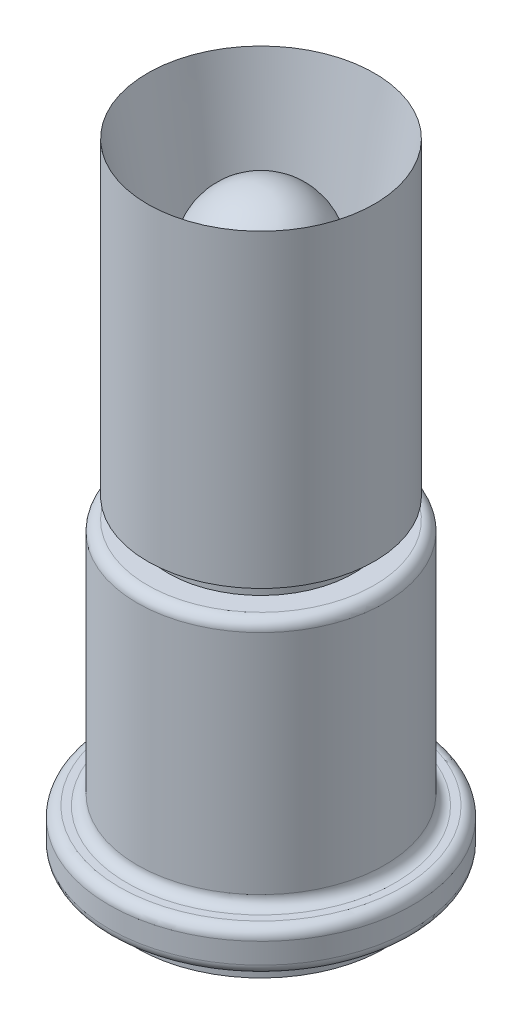
ISO-10303-21;
HEADER;
FILE_DESCRIPTION(('STEP AP214'),'2;1');
FILE_NAME('part.step','',(''),(''),'','','');
FILE_SCHEMA(('AUTOMOTIVE_DESIGN { 1 0 10303 214 1 1 1 1 }'));
ENDSEC;
DATA;
#1=APPLICATION_CONTEXT('core data for automotive mechanical design processes');
#2=APPLICATION_PROTOCOL_DEFINITION('international standard','automotive_design',2000,#1);
#3=PRODUCT_CONTEXT('',#1,'mechanical');
#4=PRODUCT('Part','Part','',(#3));
#5=PRODUCT_RELATED_PRODUCT_CATEGORY('part','',(#4));
#6=PRODUCT_DEFINITION_FORMATION('','',#4);
#7=PRODUCT_DEFINITION_CONTEXT('part definition',#1,'design');
#8=PRODUCT_DEFINITION('design','',#6,#7);
#9=PRODUCT_DEFINITION_SHAPE('','',#8);
#10=(LENGTH_UNIT() NAMED_UNIT(*) SI_UNIT(.MILLI.,.METRE.));
#11=(NAMED_UNIT(*) PLANE_ANGLE_UNIT() SI_UNIT($,.RADIAN.));
#12=(NAMED_UNIT(*) SI_UNIT($,.STERADIAN.) SOLID_ANGLE_UNIT());
#13=UNCERTAINTY_MEASURE_WITH_UNIT(LENGTH_MEASURE(1.E-05),#10,'distance_accuracy_value','');
#14=(GEOMETRIC_REPRESENTATION_CONTEXT(3) GLOBAL_UNCERTAINTY_ASSIGNED_CONTEXT((#13)) GLOBAL_UNIT_ASSIGNED_CONTEXT((#10,
#11,#12)) REPRESENTATION_CONTEXT('',''));
#15=CARTESIAN_POINT('',(0.,0.,0.));
#16=DIRECTION('',(0.,0.,1.));
#17=DIRECTION('',(1.,0.,0.));
#18=AXIS2_PLACEMENT_3D('',#15,#16,#17);
#19=CARTESIAN_POINT('',(0.,0.,0.));
#20=DIRECTION('',(0.,1.,0.));
#21=DIRECTION('',(0.,0.,1.));
#22=AXIS2_PLACEMENT_3D('',#19,#20,#21);
#23=PLANE('',#22);
#24=CARTESIAN_POINT('',(0.,0.,0.));
#25=DIRECTION('',(0.,1.,0.));
#26=DIRECTION('',(0.,0.,1.));
#27=AXIS2_PLACEMENT_3D('',#24,#25,#26);
#28=CIRCLE('',#27,3.43);
#29=CARTESIAN_POINT('',(0.,0.,3.43));
#30=VERTEX_POINT('',#29);
#31=EDGE_CURVE('E57',#30,#30,#28,.F.);
#32=ORIENTED_EDGE('',*,*,#31,.T.);
#33=EDGE_LOOP('',(#32));
#34=FACE_BOUND('',#33,.T.);
#35=CARTESIAN_POINT('',(0.,0.,0.));
#36=DIRECTION('',(0.,1.,0.));
#37=DIRECTION('',(0.,0.,1.));
#38=AXIS2_PLACEMENT_3D('',#35,#36,#37);
#39=CIRCLE('',#38,3.);
#40=CARTESIAN_POINT('',(0.,0.,3.));
#41=VERTEX_POINT('',#40);
#42=EDGE_CURVE('E70',#41,#41,#39,.T.);
#43=ORIENTED_EDGE('',*,*,#42,.T.);
#44=EDGE_LOOP('',(#43));
#45=FACE_BOUND('',#44,.T.);
#46=ADVANCED_FACE('F34',(#34,#45),#23,.F.);
#47=CARTESIAN_POINT('',(0.,15.,0.));
#48=DIRECTION('',(0.,1.,0.));
#49=DIRECTION('',(0.,0.,1.));
#50=AXIS2_PLACEMENT_3D('',#47,#48,#49);
#51=CYLINDRICAL_SURFACE('',#50,3.68);
#52=CARTESIAN_POINT('',(0.,0.25,0.));
#53=DIRECTION('',(0.,1.,0.));
#54=DIRECTION('',(0.,0.,1.));
#55=AXIS2_PLACEMENT_3D('',#52,#53,#54);
#56=CIRCLE('',#55,3.68);
#57=CARTESIAN_POINT('',(0.,0.25,3.68));
#58=VERTEX_POINT('',#57);
#59=EDGE_CURVE('E60',#58,#58,#56,.T.);
#60=ORIENTED_EDGE('',*,*,#59,.T.);
#61=EDGE_LOOP('',(#60));
#62=FACE_BOUND('',#61,.T.);
#63=CARTESIAN_POINT('',(0.,0.750000000000001,0.));
#64=DIRECTION('',(0.,-1.,0.));
#65=DIRECTION('',(0.,0.,-1.));
#66=AXIS2_PLACEMENT_3D('',#63,#64,#65);
#67=CIRCLE('',#66,3.68);
#68=CARTESIAN_POINT('',(0.,0.750000000000001,-3.68));
#69=VERTEX_POINT('',#68);
#70=EDGE_CURVE('E63',#69,#69,#67,.T.);
#71=ORIENTED_EDGE('',*,*,#70,.T.);
#72=EDGE_LOOP('',(#71));
#73=FACE_BOUND('',#72,.T.);
#74=ADVANCED_FACE('F109',(#62,#73),#51,.T.);
#75=CARTESIAN_POINT('',(0.,1.,-3.68));
#76=DIRECTION('',(0.,-1.,0.));
#77=DIRECTION('',(0.,0.,-1.));
#78=AXIS2_PLACEMENT_3D('',#75,#76,#77);
#79=PLANE('',#78);
#80=CARTESIAN_POINT('',(0.,1.,0.));
#81=DIRECTION('',(0.,-1.,0.));
#82=DIRECTION('',(0.,0.,-1.));
#83=AXIS2_PLACEMENT_3D('',#80,#81,#82);
#84=CIRCLE('',#83,3.43);
#85=CARTESIAN_POINT('',(0.,1.,-3.43));
#86=VERTEX_POINT('',#85);
#87=EDGE_CURVE('E49',#86,#86,#84,.F.);
#88=ORIENTED_EDGE('',*,*,#87,.T.);
#89=EDGE_LOOP('',(#88));
#90=FACE_BOUND('',#89,.T.);
#91=CARTESIAN_POINT('',(0.,1.,0.));
#92=DIRECTION('',(0.,-1.,0.));
#93=DIRECTION('',(0.,0.,-1.));
#94=AXIS2_PLACEMENT_3D('',#91,#92,#93);
#95=CIRCLE('',#94,3.25);
#96=CARTESIAN_POINT('',(0.,1.,-3.25));
#97=VERTEX_POINT('',#96);
#98=EDGE_CURVE('E54',#97,#97,#95,.T.);
#99=ORIENTED_EDGE('',*,*,#98,.T.);
#100=EDGE_LOOP('',(#99));
#101=FACE_BOUND('',#100,.T.);
#102=ADVANCED_FACE('F115',(#90,#101),#79,.F.);
#103=CARTESIAN_POINT('',(0.,15.,0.));
#104=DIRECTION('',(0.,1.,0.));
#105=DIRECTION('',(0.,0.,1.));
#106=AXIS2_PLACEMENT_3D('',#103,#104,#105);
#107=CYLINDRICAL_SURFACE('',#106,3.);
#108=CARTESIAN_POINT('',(0.,6.75,0.));
#109=DIRECTION('',(0.,-1.,0.));
#110=DIRECTION('',(0.,0.,-1.));
#111=AXIS2_PLACEMENT_3D('',#108,#109,#110);
#112=CIRCLE('',#111,3.);
#113=CARTESIAN_POINT('',(0.,6.75,-3.));
#114=VERTEX_POINT('',#113);
#115=EDGE_CURVE('E10',#114,#114,#112,.T.);
#116=ORIENTED_EDGE('',*,*,#115,.T.);
#117=EDGE_LOOP('',(#116));
#118=FACE_BOUND('',#117,.T.);
#119=CARTESIAN_POINT('',(0.,1.25,0.));
#120=DIRECTION('',(0.,-1.,0.));
#121=DIRECTION('',(0.,0.,-1.));
#122=AXIS2_PLACEMENT_3D('',#119,#120,#121);
#123=CIRCLE('',#122,3.);
#124=CARTESIAN_POINT('',(0.,1.25,-3.));
#125=VERTEX_POINT('',#124);
#126=EDGE_CURVE('E41',#125,#125,#123,.F.);
#127=ORIENTED_EDGE('',*,*,#126,.T.);
#128=EDGE_LOOP('',(#127));
#129=FACE_BOUND('',#128,.T.);
#130=ADVANCED_FACE('F143',(#118,#129),#107,.T.);
#131=CARTESIAN_POINT('',(0.,7.,-3.));
#132=DIRECTION('',(0.,-1.,0.));
#133=DIRECTION('',(0.,0.,-1.));
#134=AXIS2_PLACEMENT_3D('',#131,#132,#133);
#135=PLANE('',#134);
#136=CARTESIAN_POINT('',(0.,7.,0.));
#137=DIRECTION('',(0.,-1.,0.));
#138=DIRECTION('',(0.,0.,-1.));
#139=AXIS2_PLACEMENT_3D('',#136,#137,#138);
#140=CIRCLE('',#139,2.75);
#141=CARTESIAN_POINT('',(0.,7.,-2.75));
#142=VERTEX_POINT('',#141);
#143=EDGE_CURVE('E45',#142,#142,#140,.F.);
#144=ORIENTED_EDGE('',*,*,#143,.T.);
#145=EDGE_LOOP('',(#144));
#146=FACE_BOUND('',#145,.T.);
#147=CARTESIAN_POINT('',(0.,7.,0.));
#148=DIRECTION('',(0.,1.,0.));
#149=DIRECTION('',(0.,0.,1.));
#150=AXIS2_PLACEMENT_3D('',#147,#148,#149);
#151=CIRCLE('',#150,2.25);
#152=CARTESIAN_POINT('',(0.,7.,2.25));
#153=VERTEX_POINT('',#152);
#154=EDGE_CURVE('E66',#153,#153,#151,.T.);
#155=ORIENTED_EDGE('',*,*,#154,.F.);
#156=EDGE_LOOP('',(#155));
#157=FACE_BOUND('',#156,.T.);
#158=ADVANCED_FACE('F139',(#146,#157),#135,.F.);
#159=CARTESIAN_POINT('',(0.,15.,0.));
#160=DIRECTION('',(0.,1.,0.));
#161=DIRECTION('',(0.,0.,1.));
#162=AXIS2_PLACEMENT_3D('',#159,#160,#161);
#163=CYLINDRICAL_SURFACE('',#162,2.25);
#164=CARTESIAN_POINT('',(0.,7.5,0.));
#165=DIRECTION('',(0.,1.,0.));
#166=DIRECTION('',(0.,0.,1.));
#167=AXIS2_PLACEMENT_3D('',#164,#165,#166);
#168=CIRCLE('',#167,2.25);
#169=CARTESIAN_POINT('',(0.,7.5,2.25));
#170=VERTEX_POINT('',#169);
#171=EDGE_CURVE('E74',#170,#170,#168,.T.);
#172=ORIENTED_EDGE('',*,*,#171,.F.);
#173=EDGE_LOOP('',(#172));
#174=FACE_BOUND('',#173,.T.);
#175=ORIENTED_EDGE('',*,*,#154,.T.);
#176=EDGE_LOOP('',(#175));
#177=FACE_BOUND('',#176,.T.);
#178=ADVANCED_FACE('F142',(#174,#177),#163,.T.);
#179=CARTESIAN_POINT('',(0.,7.5,-2.25));
#180=DIRECTION('',(0.,1.,0.));
#181=DIRECTION('',(0.,0.,1.));
#182=AXIS2_PLACEMENT_3D('',#179,#180,#181);
#183=PLANE('',#182);
#184=CARTESIAN_POINT('',(0.,7.5,0.));
#185=DIRECTION('',(0.,1.,0.));
#186=DIRECTION('',(0.,0.,1.));
#187=AXIS2_PLACEMENT_3D('',#184,#185,#186);
#188=CIRCLE('',#187,2.75);
#189=CARTESIAN_POINT('',(0.,7.5,2.75));
#190=VERTEX_POINT('',#189);
#191=EDGE_CURVE('E77',#190,#190,#188,.T.);
#192=ORIENTED_EDGE('',*,*,#191,.F.);
#193=EDGE_LOOP('',(#192));
#194=FACE_BOUND('',#193,.T.);
#195=ORIENTED_EDGE('',*,*,#171,.T.);
#196=EDGE_LOOP('',(#195));
#197=FACE_BOUND('',#196,.T.);
#198=ADVANCED_FACE('F148',(#194,#197),#183,.F.);
#199=CARTESIAN_POINT('',(0.,15.,0.));
#200=DIRECTION('',(0.,1.,0.));
#201=DIRECTION('',(0.,0.,1.));
#202=AXIS2_PLACEMENT_3D('',#199,#200,#201);
#203=CYLINDRICAL_SURFACE('',#202,2.75);
#204=CARTESIAN_POINT('',(0.,15.,0.));
#205=DIRECTION('',(0.,1.,0.));
#206=DIRECTION('',(0.,0.,1.));
#207=AXIS2_PLACEMENT_3D('',#204,#205,#206);
#208=CIRCLE('',#207,2.75);
#209=CARTESIAN_POINT('',(0.,15.,2.75));
#210=VERTEX_POINT('',#209);
#211=EDGE_CURVE('E87',#210,#210,#208,.T.);
#212=ORIENTED_EDGE('',*,*,#211,.F.);
#213=EDGE_LOOP('',(#212));
#214=FACE_BOUND('',#213,.T.);
#215=ORIENTED_EDGE('',*,*,#191,.T.);
#216=EDGE_LOOP('',(#215));
#217=FACE_BOUND('',#216,.T.);
#218=ADVANCED_FACE('F154',(#214,#217),#203,.T.);
#219=CARTESIAN_POINT('',(0.,-0.5,0.));
#220=DIRECTION('',(0.,1.,0.));
#221=DIRECTION('',(0.,0.,1.));
#222=AXIS2_PLACEMENT_3D('',#219,#220,#221);
#223=PLANE('',#222);
#224=CARTESIAN_POINT('',(0.,-0.5,0.));
#225=DIRECTION('',(0.,1.,0.));
#226=DIRECTION('',(0.,0.,1.));
#227=AXIS2_PLACEMENT_3D('',#224,#225,#226);
#228=CIRCLE('',#227,0.86602540378444);
#229=CARTESIAN_POINT('',(0.,-0.5,0.866025403784439));
#230=VERTEX_POINT('',#229);
#231=EDGE_CURVE('E67',#230,#230,#228,.T.);
#232=ORIENTED_EDGE('',*,*,#231,.T.);
#233=EDGE_LOOP('',(#232));
#234=FACE_BOUND('',#233,.T.);
#235=CARTESIAN_POINT('',(0.,-0.5,0.));
#236=DIRECTION('',(0.,1.,0.));
#237=DIRECTION('',(0.,0.,1.));
#238=AXIS2_PLACEMENT_3D('',#235,#236,#237);
#239=CIRCLE('',#238,3.);
#240=CARTESIAN_POINT('',(0.,-0.500000000000001,3.));
#241=VERTEX_POINT('',#240);
#242=EDGE_CURVE('E80',#241,#241,#239,.T.);
#243=ORIENTED_EDGE('',*,*,#242,.F.);
#244=EDGE_LOOP('',(#243));
#245=FACE_BOUND('',#244,.T.);
#246=ADVANCED_FACE('F236',(#234,#245),#223,.F.);
#247=CARTESIAN_POINT('',(0.,0.,0.));
#248=DIRECTION('',(0.,1.,0.));
#249=DIRECTION('',(0.,0.,1.));
#250=AXIS2_PLACEMENT_3D('',#247,#248,#249);
#251=CYLINDRICAL_SURFACE('',#250,3.);
#252=ORIENTED_EDGE('',*,*,#42,.F.);
#253=EDGE_LOOP('',(#252));
#254=FACE_BOUND('',#253,.T.);
#255=ORIENTED_EDGE('',*,*,#242,.T.);
#256=EDGE_LOOP('',(#255));
#257=FACE_BOUND('',#256,.T.);
#258=ADVANCED_FACE('F228',(#254,#257),#251,.T.);
#259=CARTESIAN_POINT('',(0.,0.,0.));
#260=DIRECTION('',(0.,-1.,0.));
#261=DIRECTION('',(0.,0.,1.));
#262=AXIS2_PLACEMENT_3D('',#259,#260,#261);
#263=SPHERICAL_SURFACE('',#262,1.);
#264=ORIENTED_EDGE('',*,*,#231,.F.);
#265=EDGE_LOOP('',(#264));
#266=FACE_BOUND('',#265,.T.);
#267=ADVANCED_FACE('F125',(#266),#263,.T.);
#268=CARTESIAN_POINT('',(0.,0.25,0.));
#269=DIRECTION('',(0.,1.,0.));
#270=DIRECTION('',(0.,0.,1.));
#271=AXIS2_PLACEMENT_3D('',#268,#269,#270);
#272=TOROIDAL_SURFACE('',#271,3.43,0.25);
#273=ORIENTED_EDGE('',*,*,#31,.F.);
#274=EDGE_LOOP('',(#273));
#275=FACE_BOUND('',#274,.T.);
#276=ORIENTED_EDGE('',*,*,#59,.F.);
#277=EDGE_LOOP('',(#276));
#278=FACE_BOUND('',#277,.T.);
#279=ADVANCED_FACE('F121',(#275,#278),#272,.T.);
#280=CARTESIAN_POINT('',(0.,0.750000000000001,0.));
#281=DIRECTION('',(0.,-1.,0.));
#282=DIRECTION('',(0.,0.,-1.));
#283=AXIS2_PLACEMENT_3D('',#280,#281,#282);
#284=TOROIDAL_SURFACE('',#283,3.43,0.25);
#285=ORIENTED_EDGE('',*,*,#70,.F.);
#286=EDGE_LOOP('',(#285));
#287=FACE_BOUND('',#286,.T.);
#288=ORIENTED_EDGE('',*,*,#87,.F.);
#289=EDGE_LOOP('',(#288));
#290=FACE_BOUND('',#289,.T.);
#291=ADVANCED_FACE('F124',(#287,#290),#284,.T.);
#292=CARTESIAN_POINT('',(0.,6.75,0.));
#293=DIRECTION('',(0.,-1.,0.));
#294=DIRECTION('',(0.,0.,-1.));
#295=AXIS2_PLACEMENT_3D('',#292,#293,#294);
#296=TOROIDAL_SURFACE('',#295,2.75,0.25);
#297=ORIENTED_EDGE('',*,*,#115,.F.);
#298=EDGE_LOOP('',(#297));
#299=FACE_BOUND('',#298,.T.);
#300=ORIENTED_EDGE('',*,*,#143,.F.);
#301=EDGE_LOOP('',(#300));
#302=FACE_BOUND('',#301,.T.);
#303=ADVANCED_FACE('F128',(#299,#302),#296,.T.);
#304=CARTESIAN_POINT('',(0.,1.25,0.));
#305=DIRECTION('',(0.,-1.,0.));
#306=DIRECTION('',(0.,0.,-1.));
#307=AXIS2_PLACEMENT_3D('',#304,#305,#306);
#308=TOROIDAL_SURFACE('',#307,3.25,0.25);
#309=ORIENTED_EDGE('',*,*,#98,.F.);
#310=EDGE_LOOP('',(#309));
#311=FACE_BOUND('',#310,.T.);
#312=ORIENTED_EDGE('',*,*,#126,.F.);
#313=EDGE_LOOP('',(#312));
#314=FACE_BOUND('',#313,.T.);
#315=ADVANCED_FACE('F36',(#311,#314),#308,.F.);
#316=CARTESIAN_POINT('',(0.,8.,0.));
#317=DIRECTION('',(0.,1.,0.));
#318=DIRECTION('',(0.,0.,1.));
#319=AXIS2_PLACEMENT_3D('',#316,#317,#318);
#320=CONICAL_SURFACE('',#319,1.5,0.176708856070037);
#321=ORIENTED_EDGE('',*,*,#211,.T.);
#322=EDGE_LOOP('',(#321));
#323=FACE_BOUND('',#322,.T.);
#324=CARTESIAN_POINT('',(0.,8.,0.));
#325=DIRECTION('',(0.,1.,0.));
#326=DIRECTION('',(0.,0.,1.));
#327=AXIS2_PLACEMENT_3D('',#324,#325,#326);
#328=CIRCLE('',#327,1.5);
#329=CARTESIAN_POINT('',(0.,8.,1.5));
#330=VERTEX_POINT('',#329);
#331=EDGE_CURVE('E71',#330,#330,#328,.T.);
#332=ORIENTED_EDGE('',*,*,#331,.F.);
#333=EDGE_LOOP('',(#332));
#334=FACE_BOUND('',#333,.T.);
#335=ADVANCED_FACE('F99',(#323,#334),#320,.F.);
#336=CARTESIAN_POINT('',(0.,12.5,0.));
#337=DIRECTION('',(0.,-1.,0.));
#338=DIRECTION('',(0.,0.,-1.));
#339=AXIS2_PLACEMENT_3D('',#336,#337,#338);
#340=SPHERICAL_SURFACE('',#339,1.5);
#341=CARTESIAN_POINT('',(0.,12.5,0.));
#342=DIRECTION('',(0.,-1.,0.));
#343=DIRECTION('',(0.,0.,-1.));
#344=AXIS2_PLACEMENT_3D('',#341,#342,#343);
#345=CIRCLE('',#344,1.5);
#346=CARTESIAN_POINT('',(0.,12.5,-1.5));
#347=VERTEX_POINT('',#346);
#348=EDGE_CURVE('E90',#347,#347,#345,.T.);
#349=ORIENTED_EDGE('',*,*,#348,.F.);
#350=EDGE_LOOP('',(#349));
#351=FACE_BOUND('',#350,.T.);
#352=ADVANCED_FACE('F97',(#351),#340,.T.);
#353=CARTESIAN_POINT('',(0.,8.,0.));
#354=DIRECTION('',(0.,-1.,0.));
#355=DIRECTION('',(0.,0.,-1.));
#356=AXIS2_PLACEMENT_3D('',#353,#354,#355);
#357=CYLINDRICAL_SURFACE('',#356,1.5);
#358=ORIENTED_EDGE('',*,*,#348,.T.);
#359=EDGE_LOOP('',(#358));
#360=FACE_BOUND('',#359,.T.);
#361=ORIENTED_EDGE('',*,*,#331,.T.);
#362=EDGE_LOOP('',(#361));
#363=FACE_BOUND('',#362,.T.);
#364=ADVANCED_FACE('F94',(#360,#363),#357,.T.);
#365=CLOSED_SHELL('',(#46,#74,#102,#130,#158,#178,#198,#218,#246,#258,#267,#279,#291,#303,#315,
#335,#352,#364));
#366=MANIFOLD_SOLID_BREP('B2',#365);
#367=ADVANCED_BREP_SHAPE_REPRESENTATION('',(#18,#366),#14);
#368=SHAPE_DEFINITION_REPRESENTATION(#9,#367);
ENDSEC;
END-ISO-10303-21;
